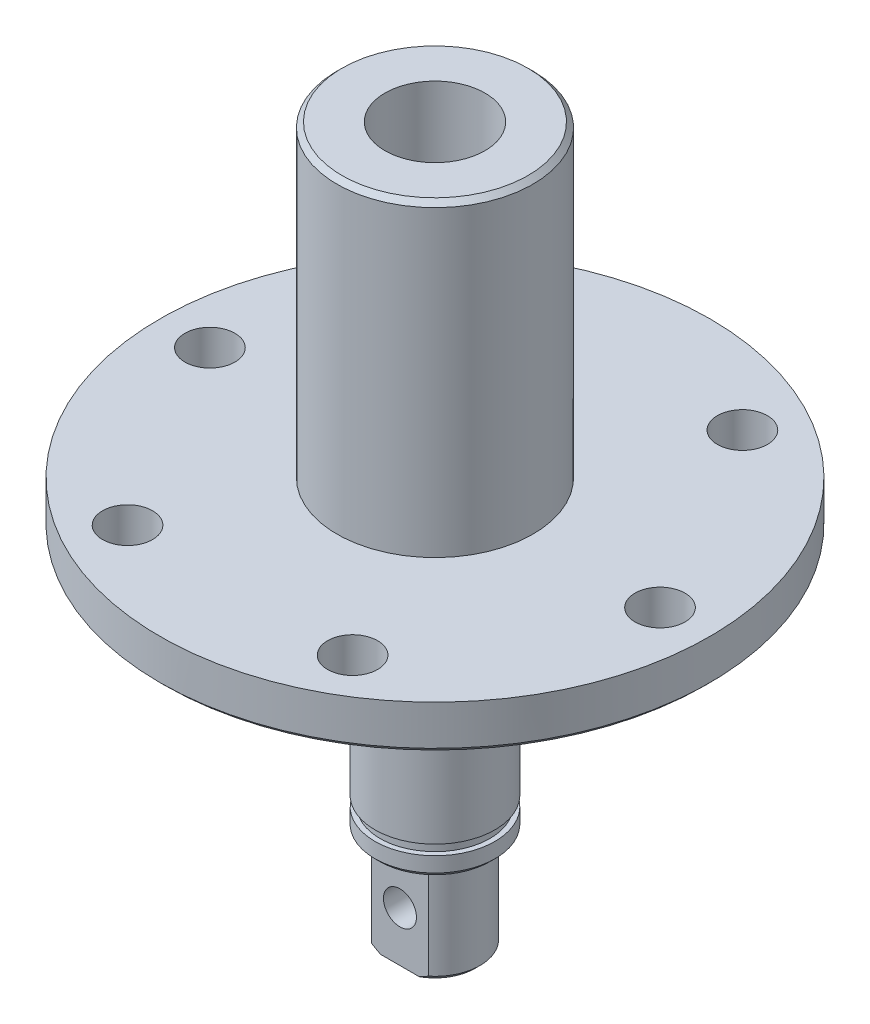
ISO-10303-21;
HEADER;
FILE_DESCRIPTION(('STEP AP214'),'2;1');
FILE_NAME('part.step','',(''),(''),'','','');
FILE_SCHEMA(('AUTOMOTIVE_DESIGN { 1 0 10303 214 1 1 1 1 }'));
ENDSEC;
DATA;
#1=APPLICATION_CONTEXT('core data for automotive mechanical design processes');
#2=APPLICATION_PROTOCOL_DEFINITION('international standard','automotive_design',2000,#1);
#3=PRODUCT_CONTEXT('',#1,'mechanical');
#4=PRODUCT('Part','Part','',(#3));
#5=PRODUCT_RELATED_PRODUCT_CATEGORY('part','',(#4));
#6=PRODUCT_DEFINITION_FORMATION('','',#4);
#7=PRODUCT_DEFINITION_CONTEXT('part definition',#1,'design');
#8=PRODUCT_DEFINITION('design','',#6,#7);
#9=PRODUCT_DEFINITION_SHAPE('','',#8);
#10=(LENGTH_UNIT() NAMED_UNIT(*) SI_UNIT(.MILLI.,.METRE.));
#11=(NAMED_UNIT(*) PLANE_ANGLE_UNIT() SI_UNIT($,.RADIAN.));
#12=(NAMED_UNIT(*) SI_UNIT($,.STERADIAN.) SOLID_ANGLE_UNIT());
#13=UNCERTAINTY_MEASURE_WITH_UNIT(LENGTH_MEASURE(1.E-05),#10,'distance_accuracy_value','');
#14=(GEOMETRIC_REPRESENTATION_CONTEXT(3) GLOBAL_UNCERTAINTY_ASSIGNED_CONTEXT((#13)) GLOBAL_UNIT_ASSIGNED_CONTEXT((#10,
#11,#12)) REPRESENTATION_CONTEXT('',''));
#15=CARTESIAN_POINT('',(0.,0.,0.));
#16=DIRECTION('',(0.,0.,1.));
#17=DIRECTION('',(1.,0.,0.));
#18=AXIS2_PLACEMENT_3D('',#15,#16,#17);
#19=CARTESIAN_POINT('',(0.,-35.5000000000132,0.));
#20=DIRECTION('',(0.,1.,0.));
#21=DIRECTION('',(0.,0.,1.));
#22=AXIS2_PLACEMENT_3D('',#19,#20,#21);
#23=CONICAL_SURFACE('',#22,4.50000000000728,0.785398163397448);
#24=CARTESIAN_POINT('',(-2.82842712475474,-35.5000000000151,-3.5));
#25=CARTESIAN_POINT('',(-2.75622586338194,-35.5453737170798,-3.5));
#26=CARTESIAN_POINT('',(-2.68355248238269,-35.5900081388515,-3.5));
#27=CARTESIAN_POINT('',(-2.53721817161057,-35.6774981598045,-3.5));
#28=CARTESIAN_POINT('',(-2.46355802504001,-35.7203550705901,-3.5));
#29=CARTESIAN_POINT('',(-2.31508833053428,-35.8040646548458,-3.5));
#30=CARTESIAN_POINT('',(-2.24027862426758,-35.8449170489204,-3.5));
#31=CARTESIAN_POINT('',(-2.08936628540242,-35.9242977474013,-3.5));
#32=CARTESIAN_POINT('',(-2.01326272190324,-35.9628242791198,-3.5));
#33=CARTESIAN_POINT('',(-1.93649167311454,-36.0000000000152,-3.5));
#34=B_SPLINE_CURVE_WITH_KNOTS('',3,(#24,#25,#26,#27,#28,#29,#30,#31,#32,#33),.UNSPECIFIED.,.F.,
.F.,(4,2,2,2,4),(0.,0.255829091678936,0.511465923841207,0.767138286787565,1.02300311577789),.UNSPECIFIED.);
#35=CARTESIAN_POINT('',(-2.82842712475046,-35.5000000000076,-3.5));
#36=VERTEX_POINT('',#35);
#37=CARTESIAN_POINT('',(-1.93649167312885,-36.0000000000083,-3.5));
#38=VERTEX_POINT('',#37);
#39=EDGE_CURVE('E81',#36,#38,#34,.T.);
#40=ORIENTED_EDGE('',*,*,#39,.T.);
#41=CARTESIAN_POINT('',(0.,-36.0000000000014,0.));
#42=DIRECTION('',(0.,1.,0.));
#43=DIRECTION('',(0.,0.,1.));
#44=AXIS2_PLACEMENT_3D('',#41,#42,#43);
#45=CIRCLE('',#44,4.0000000000191);
#46=CARTESIAN_POINT('',(-1.93649167312885,-36.0000000000083,3.5));
#47=VERTEX_POINT('',#46);
#48=EDGE_CURVE('E79',#47,#38,#45,.F.);
#49=ORIENTED_EDGE('',*,*,#48,.F.);
#50=CARTESIAN_POINT('',(-1.93649167311454,-36.0000000000152,3.5));
#51=CARTESIAN_POINT('',(-2.01326272190325,-35.9628242791198,3.5));
#52=CARTESIAN_POINT('',(-2.08936628540243,-35.9242977474013,3.5));
#53=CARTESIAN_POINT('',(-2.24027862426758,-35.8449170489204,3.5));
#54=CARTESIAN_POINT('',(-2.31508833053428,-35.8040646548458,3.5));
#55=CARTESIAN_POINT('',(-2.46355802504001,-35.7203550705901,3.5));
#56=CARTESIAN_POINT('',(-2.53721817161057,-35.6774981598045,3.5));
#57=CARTESIAN_POINT('',(-2.68355248238269,-35.5900081388515,3.5));
#58=CARTESIAN_POINT('',(-2.75622586338194,-35.5453737170798,3.5));
#59=CARTESIAN_POINT('',(-2.82842712475474,-35.5000000000151,3.5));
#60=B_SPLINE_CURVE_WITH_KNOTS('',3,(#50,#51,#52,#53,#54,#55,#56,#57,#58,#59),.UNSPECIFIED.,.F.,
.F.,(4,2,2,2,4),(0.,0.255864828990319,0.511537191936677,0.767174024098948,1.02300311577788),.UNSPECIFIED.);
#61=CARTESIAN_POINT('',(-2.82842712475046,-35.5000000000076,3.5));
#62=VERTEX_POINT('',#61);
#63=EDGE_CURVE('E21',#47,#62,#60,.T.);
#64=ORIENTED_EDGE('',*,*,#63,.T.);
#65=CARTESIAN_POINT('',(0.,-35.5,0.));
#66=DIRECTION('',(0.,1.,0.));
#67=DIRECTION('',(0.,0.,1.));
#68=AXIS2_PLACEMENT_3D('',#65,#66,#67);
#69=CIRCLE('',#68,4.5);
#70=EDGE_CURVE('E76',#36,#62,#69,.T.);
#71=ORIENTED_EDGE('',*,*,#70,.F.);
#72=EDGE_LOOP('',(#40,#49,#64,#71));
#73=FACE_BOUND('',#72,.T.);
#74=ADVANCED_FACE('F17',(#73),#23,.T.);
#75=CARTESIAN_POINT('',(0.,-35.5000000000132,0.));
#76=DIRECTION('',(0.,1.,0.));
#77=DIRECTION('',(0.,0.,1.));
#78=AXIS2_PLACEMENT_3D('',#75,#76,#77);
#79=CONICAL_SURFACE('',#78,4.50000000000728,0.785398163397448);
#80=CARTESIAN_POINT('',(2.8284271247554,-35.5000000000147,3.5));
#81=CARTESIAN_POINT('',(2.75622586338244,-35.5453737170795,3.5));
#82=CARTESIAN_POINT('',(2.68355248238303,-35.5900081388512,3.5));
#83=CARTESIAN_POINT('',(2.53721817161058,-35.6774981598045,3.5));
#84=CARTESIAN_POINT('',(2.46355802503985,-35.7203550705902,3.5));
#85=CARTESIAN_POINT('',(2.31508833053378,-35.8040646548461,3.5));
#86=CARTESIAN_POINT('',(2.24027862426691,-35.8449170489208,3.5));
#87=CARTESIAN_POINT('',(2.08936628540139,-35.9242977474018,3.5));
#88=CARTESIAN_POINT('',(2.01326272190203,-35.9628242791204,3.5));
#89=CARTESIAN_POINT('',(1.93649167311315,-36.0000000000159,3.5));
#90=B_SPLINE_CURVE_WITH_KNOTS('',3,(#80,#81,#82,#83,#84,#85,#86,#87,#88,#89),.UNSPECIFIED.,.F.,
.F.,(4,2,2,2,4),(0.,0.255829091679521,0.511465923842371,0.76713828678931,1.02300311578021),.UNSPECIFIED.);
#91=CARTESIAN_POINT('',(2.8284271247508,-35.5000000000073,3.5));
#92=VERTEX_POINT('',#91);
#93=CARTESIAN_POINT('',(1.93649167312816,-36.0000000000086,3.5));
#94=VERTEX_POINT('',#93);
#95=EDGE_CURVE('E102',#92,#94,#90,.T.);
#96=ORIENTED_EDGE('',*,*,#95,.T.);
#97=CARTESIAN_POINT('',(0.,-36.0000000000014,0.));
#98=DIRECTION('',(0.,1.,0.));
#99=DIRECTION('',(0.,0.,1.));
#100=AXIS2_PLACEMENT_3D('',#97,#98,#99);
#101=CIRCLE('',#100,4.0000000000191);
#102=CARTESIAN_POINT('',(1.93649167312885,-36.0000000000083,-3.5));
#103=VERTEX_POINT('',#102);
#104=EDGE_CURVE('E89',#103,#94,#101,.F.);
#105=ORIENTED_EDGE('',*,*,#104,.F.);
#106=CARTESIAN_POINT('',(1.93649167311454,-36.0000000000152,-3.5));
#107=CARTESIAN_POINT('',(2.01326272190325,-35.9628242791198,-3.5));
#108=CARTESIAN_POINT('',(2.08936628540243,-35.9242977474013,-3.5));
#109=CARTESIAN_POINT('',(2.24027862426758,-35.8449170489204,-3.5));
#110=CARTESIAN_POINT('',(2.31508833053428,-35.8040646548458,-3.5));
#111=CARTESIAN_POINT('',(2.46355802504001,-35.7203550705901,-3.5));
#112=CARTESIAN_POINT('',(2.53721817161057,-35.6774981598045,-3.5));
#113=CARTESIAN_POINT('',(2.68355248238269,-35.5900081388515,-3.5));
#114=CARTESIAN_POINT('',(2.75622586338194,-35.5453737170798,-3.5));
#115=CARTESIAN_POINT('',(2.82842712475474,-35.5000000000151,-3.5));
#116=B_SPLINE_CURVE_WITH_KNOTS('',3,(#106,#107,#108,#109,#110,#111,#112,#113,#114,#115),
.UNSPECIFIED.,.F.,.F.,(4,2,2,2,4),(0.,0.255864828990319,0.511537191936677,0.767174024098948,
1.02300311577788),.UNSPECIFIED.);
#117=CARTESIAN_POINT('',(2.82842712475046,-35.5000000000076,-3.5));
#118=VERTEX_POINT('',#117);
#119=EDGE_CURVE('E212',#103,#118,#116,.T.);
#120=ORIENTED_EDGE('',*,*,#119,.T.);
#121=CARTESIAN_POINT('',(0.,-35.5,0.));
#122=DIRECTION('',(0.,1.,0.));
#123=DIRECTION('',(0.,0.,1.));
#124=AXIS2_PLACEMENT_3D('',#121,#122,#123);
#125=CIRCLE('',#124,4.5);
#126=EDGE_CURVE('E100',#92,#118,#125,.T.);
#127=ORIENTED_EDGE('',*,*,#126,.F.);
#128=EDGE_LOOP('',(#96,#105,#120,#127));
#129=FACE_BOUND('',#128,.T.);
#130=ADVANCED_FACE('F203',(#129),#79,.T.);
#131=CARTESIAN_POINT('',(0.,-31.,-3.5));
#132=DIRECTION('',(0.,0.,-1.));
#133=DIRECTION('',(-1.,0.,0.));
#134=AXIS2_PLACEMENT_3D('',#131,#132,#133);
#135=CYLINDRICAL_SURFACE('',#134,1.65);
#136=CARTESIAN_POINT('',(0.,-31.,3.5));
#137=DIRECTION('',(0.,0.,-1.));
#138=DIRECTION('',(-1.,0.,0.));
#139=AXIS2_PLACEMENT_3D('',#136,#137,#138);
#140=CIRCLE('',#139,1.65);
#141=CARTESIAN_POINT('',(-1.65,-31.,3.5));
#142=VERTEX_POINT('',#141);
#143=EDGE_CURVE('E88',#142,#142,#140,.F.);
#144=ORIENTED_EDGE('',*,*,#143,.T.);
#145=EDGE_LOOP('',(#144));
#146=FACE_BOUND('',#145,.T.);
#147=CARTESIAN_POINT('',(0.,-31.,-3.5));
#148=DIRECTION('',(0.,0.,-1.));
#149=DIRECTION('',(-1.,0.,0.));
#150=AXIS2_PLACEMENT_3D('',#147,#148,#149);
#151=CIRCLE('',#150,1.65);
#152=CARTESIAN_POINT('',(-1.65,-31.,-3.5));
#153=VERTEX_POINT('',#152);
#154=EDGE_CURVE('E107',#153,#153,#151,.T.);
#155=ORIENTED_EDGE('',*,*,#154,.T.);
#156=EDGE_LOOP('',(#155));
#157=FACE_BOUND('',#156,.T.);
#158=ADVANCED_FACE('F207',(#146,#157),#135,.F.);
#159=CARTESIAN_POINT('',(0.,-36.,0.));
#160=DIRECTION('',(0.,-1.,0.));
#161=DIRECTION('',(0.,0.,-1.));
#162=AXIS2_PLACEMENT_3D('',#159,#160,#161);
#163=PLANE('',#162);
#164=DIRECTION('',(1.,0.,0.));
#165=VECTOR('',#164,1.);
#166=CARTESIAN_POINT('',(-2.82842712474619,-36.,-3.5));
#167=LINE('',#166,#165);
#168=EDGE_CURVE('E191',#38,#103,#167,.T.);
#169=ORIENTED_EDGE('',*,*,#168,.T.);
#170=ORIENTED_EDGE('',*,*,#104,.T.);
#171=DIRECTION('',(-1.,0.,0.));
#172=VECTOR('',#171,1.);
#173=CARTESIAN_POINT('',(-2.82842712474619,-36.,3.5));
#174=LINE('',#173,#172);
#175=EDGE_CURVE('E97',#94,#47,#174,.T.);
#176=ORIENTED_EDGE('',*,*,#175,.T.);
#177=ORIENTED_EDGE('',*,*,#48,.T.);
#178=EDGE_LOOP('',(#169,#170,#176,#177));
#179=FACE_BOUND('',#178,.T.);
#180=ADVANCED_FACE('F359',(#179),#163,.T.);
#181=CARTESIAN_POINT('',(0.,-36.,0.));
#182=DIRECTION('',(0.,1.,0.));
#183=DIRECTION('',(0.,0.,1.));
#184=AXIS2_PLACEMENT_3D('',#181,#182,#183);
#185=CYLINDRICAL_SURFACE('',#184,4.5);
#186=DIRECTION('',(0.,1.,0.));
#187=VECTOR('',#186,1.);
#188=CARTESIAN_POINT('',(-2.82842712474619,-26.,3.5));
#189=LINE('',#188,#187);
#190=CARTESIAN_POINT('',(-2.82842712474619,-26.,3.5));
#191=VERTEX_POINT('',#190);
#192=EDGE_CURVE('E84',#62,#191,#189,.T.);
#193=ORIENTED_EDGE('',*,*,#192,.T.);
#194=CARTESIAN_POINT('',(0.,-26.,0.));
#195=DIRECTION('',(0.,1.,0.));
#196=DIRECTION('',(0.,0.,1.));
#197=AXIS2_PLACEMENT_3D('',#194,#195,#196);
#198=CIRCLE('',#197,4.5);
#199=CARTESIAN_POINT('',(-2.82842712474619,-26.,-3.5));
#200=VERTEX_POINT('',#199);
#201=EDGE_CURVE('E189',#200,#191,#198,.T.);
#202=ORIENTED_EDGE('',*,*,#201,.F.);
#203=DIRECTION('',(0.,1.,0.));
#204=VECTOR('',#203,1.);
#205=CARTESIAN_POINT('',(-2.82842712474619,-26.,-3.5));
#206=LINE('',#205,#204);
#207=EDGE_CURVE('E87',#200,#36,#206,.F.);
#208=ORIENTED_EDGE('',*,*,#207,.T.);
#209=ORIENTED_EDGE('',*,*,#70,.T.);
#210=EDGE_LOOP('',(#193,#202,#208,#209));
#211=FACE_BOUND('',#210,.T.);
#212=ADVANCED_FACE('F83',(#211),#185,.T.);
#213=CARTESIAN_POINT('',(-2.82842712474619,-26.,3.5));
#214=DIRECTION('',(0.,0.,-1.));
#215=DIRECTION('',(-1.,0.,0.));
#216=AXIS2_PLACEMENT_3D('',#213,#214,#215);
#217=PLANE('',#216);
#218=ORIENTED_EDGE('',*,*,#63,.F.);
#219=ORIENTED_EDGE('',*,*,#175,.F.);
#220=ORIENTED_EDGE('',*,*,#95,.F.);
#221=DIRECTION('',(0.,1.,0.));
#222=VECTOR('',#221,1.);
#223=CARTESIAN_POINT('',(2.82842712474619,-36.,3.5));
#224=LINE('',#223,#222);
#225=CARTESIAN_POINT('',(2.82842712474619,-26.,3.5));
#226=VERTEX_POINT('',#225);
#227=EDGE_CURVE('E96',#226,#92,#224,.F.);
#228=ORIENTED_EDGE('',*,*,#227,.F.);
#229=DIRECTION('',(1.,0.,0.));
#230=VECTOR('',#229,1.);
#231=CARTESIAN_POINT('',(0.,-26.,3.5));
#232=LINE('',#231,#230);
#233=EDGE_CURVE('E94',#191,#226,#232,.T.);
#234=ORIENTED_EDGE('',*,*,#233,.F.);
#235=ORIENTED_EDGE('',*,*,#192,.F.);
#236=EDGE_LOOP('',(#218,#219,#220,#228,#234,#235));
#237=FACE_BOUND('',#236,.T.);
#238=ORIENTED_EDGE('',*,*,#143,.F.);
#239=EDGE_LOOP('',(#238));
#240=FACE_BOUND('',#239,.T.);
#241=ADVANCED_FACE('F91',(#237,#240),#217,.F.);
#242=CARTESIAN_POINT('',(0.,-36.,0.));
#243=DIRECTION('',(0.,1.,0.));
#244=DIRECTION('',(0.,0.,1.));
#245=AXIS2_PLACEMENT_3D('',#242,#243,#244);
#246=CYLINDRICAL_SURFACE('',#245,4.5);
#247=DIRECTION('',(0.,1.,0.));
#248=VECTOR('',#247,1.);
#249=CARTESIAN_POINT('',(2.82842712474619,-26.,-3.5));
#250=LINE('',#249,#248);
#251=CARTESIAN_POINT('',(2.82842712474619,-26.,-3.5));
#252=VERTEX_POINT('',#251);
#253=EDGE_CURVE('E194',#118,#252,#250,.T.);
#254=ORIENTED_EDGE('',*,*,#253,.T.);
#255=CARTESIAN_POINT('',(0.,-26.,0.));
#256=DIRECTION('',(0.,1.,0.));
#257=DIRECTION('',(0.,0.,1.));
#258=AXIS2_PLACEMENT_3D('',#255,#256,#257);
#259=CIRCLE('',#258,4.5);
#260=EDGE_CURVE('E186',#226,#252,#259,.T.);
#261=ORIENTED_EDGE('',*,*,#260,.F.);
#262=ORIENTED_EDGE('',*,*,#227,.T.);
#263=ORIENTED_EDGE('',*,*,#126,.T.);
#264=EDGE_LOOP('',(#254,#261,#262,#263));
#265=FACE_BOUND('',#264,.T.);
#266=ADVANCED_FACE('F226',(#265),#246,.T.);
#267=CARTESIAN_POINT('',(-2.82842712474619,-26.,-3.5));
#268=DIRECTION('',(0.,0.,1.));
#269=DIRECTION('',(1.,0.,0.));
#270=AXIS2_PLACEMENT_3D('',#267,#268,#269);
#271=PLANE('',#270);
#272=ORIENTED_EDGE('',*,*,#39,.F.);
#273=ORIENTED_EDGE('',*,*,#207,.F.);
#274=DIRECTION('',(1.,0.,0.));
#275=VECTOR('',#274,1.);
#276=CARTESIAN_POINT('',(0.,-26.,-3.5));
#277=LINE('',#276,#275);
#278=EDGE_CURVE('E185',#252,#200,#277,.F.);
#279=ORIENTED_EDGE('',*,*,#278,.F.);
#280=ORIENTED_EDGE('',*,*,#253,.F.);
#281=ORIENTED_EDGE('',*,*,#119,.F.);
#282=ORIENTED_EDGE('',*,*,#168,.F.);
#283=EDGE_LOOP('',(#272,#273,#279,#280,#281,#282));
#284=FACE_BOUND('',#283,.T.);
#285=ORIENTED_EDGE('',*,*,#154,.F.);
#286=EDGE_LOOP('',(#285));
#287=FACE_BOUND('',#286,.T.);
#288=ADVANCED_FACE('F221',(#284,#287),#271,.F.);
#289=CARTESIAN_POINT('',(0.,-26.,0.));
#290=DIRECTION('',(0.,-1.,0.));
#291=DIRECTION('',(0.,0.,-1.));
#292=AXIS2_PLACEMENT_3D('',#289,#290,#291);
#293=PLANE('',#292);
#294=ORIENTED_EDGE('',*,*,#260,.T.);
#295=ORIENTED_EDGE('',*,*,#278,.T.);
#296=ORIENTED_EDGE('',*,*,#201,.T.);
#297=ORIENTED_EDGE('',*,*,#233,.T.);
#298=EDGE_LOOP('',(#294,#295,#296,#297));
#299=FACE_BOUND('',#298,.T.);
#300=CARTESIAN_POINT('',(0.,-26.0000000000105,0.));
#301=DIRECTION('',(0.,1.,0.));
#302=DIRECTION('',(0.,0.,1.));
#303=AXIS2_PLACEMENT_3D('',#300,#301,#302);
#304=CIRCLE('',#303,5.49999999992679);
#305=CARTESIAN_POINT('',(0.,-26.0000000000105,5.49999999992679));
#306=VERTEX_POINT('',#305);
#307=EDGE_CURVE('E182',#306,#306,#304,.T.);
#308=ORIENTED_EDGE('',*,*,#307,.F.);
#309=EDGE_LOOP('',(#308));
#310=FACE_BOUND('',#309,.T.);
#311=ADVANCED_FACE('F225',(#299,#310),#293,.T.);
#312=CARTESIAN_POINT('',(0.,-25.5000000000791,0.));
#313=DIRECTION('',(0.,1.,0.));
#314=DIRECTION('',(0.,0.,1.));
#315=AXIS2_PLACEMENT_3D('',#312,#313,#314);
#316=CONICAL_SURFACE('',#315,5.99999999985812,0.785398163397448);
#317=CARTESIAN_POINT('',(0.,-25.5,0.));
#318=DIRECTION('',(0.,1.,0.));
#319=DIRECTION('',(0.,0.,1.));
#320=AXIS2_PLACEMENT_3D('',#317,#318,#319);
#321=CIRCLE('',#320,6.);
#322=CARTESIAN_POINT('',(0.,-25.5,6.));
#323=VERTEX_POINT('',#322);
#324=EDGE_CURVE('E181',#323,#323,#321,.T.);
#325=ORIENTED_EDGE('',*,*,#324,.F.);
#326=EDGE_LOOP('',(#325));
#327=FACE_BOUND('',#326,.T.);
#328=ORIENTED_EDGE('',*,*,#307,.T.);
#329=EDGE_LOOP('',(#328));
#330=FACE_BOUND('',#329,.T.);
#331=ADVANCED_FACE('F329',(#327,#330),#316,.T.);
#332=CARTESIAN_POINT('',(0.,-26.,0.));
#333=DIRECTION('',(0.,1.,0.));
#334=DIRECTION('',(0.,0.,1.));
#335=AXIS2_PLACEMENT_3D('',#332,#333,#334);
#336=CYLINDRICAL_SURFACE('',#335,6.);
#337=CARTESIAN_POINT('',(0.,-24.,0.));
#338=DIRECTION('',(0.,1.,0.));
#339=DIRECTION('',(0.,0.,1.));
#340=AXIS2_PLACEMENT_3D('',#337,#338,#339);
#341=CIRCLE('',#340,6.);
#342=CARTESIAN_POINT('',(0.,-24.,6.));
#343=VERTEX_POINT('',#342);
#344=EDGE_CURVE('E178',#343,#343,#341,.T.);
#345=ORIENTED_EDGE('',*,*,#344,.F.);
#346=EDGE_LOOP('',(#345));
#347=FACE_BOUND('',#346,.T.);
#348=ORIENTED_EDGE('',*,*,#324,.T.);
#349=EDGE_LOOP('',(#348));
#350=FACE_BOUND('',#349,.T.);
#351=ADVANCED_FACE('F326',(#347,#350),#336,.T.);
#352=CARTESIAN_POINT('',(-6.,-24.,0.));
#353=DIRECTION('',(0.,1.,0.));
#354=DIRECTION('',(0.,0.,1.));
#355=AXIS2_PLACEMENT_3D('',#352,#353,#354);
#356=PLANE('',#355);
#357=ORIENTED_EDGE('',*,*,#344,.T.);
#358=EDGE_LOOP('',(#357));
#359=FACE_BOUND('',#358,.T.);
#360=CARTESIAN_POINT('',(0.,-24.,0.));
#361=DIRECTION('',(0.,-1.,0.));
#362=DIRECTION('',(0.,0.,-1.));
#363=AXIS2_PLACEMENT_3D('',#360,#361,#362);
#364=CIRCLE('',#363,5.5);
#365=CARTESIAN_POINT('',(0.,-24.,-5.5));
#366=VERTEX_POINT('',#365);
#367=EDGE_CURVE('E175',#366,#366,#364,.F.);
#368=ORIENTED_EDGE('',*,*,#367,.F.);
#369=EDGE_LOOP('',(#368));
#370=FACE_BOUND('',#369,.T.);
#371=ADVANCED_FACE('F322',(#359,#370),#356,.T.);
#372=CARTESIAN_POINT('',(0.,-26.,0.));
#373=DIRECTION('',(0.,-1.,0.));
#374=DIRECTION('',(0.,0.,-1.));
#375=AXIS2_PLACEMENT_3D('',#372,#373,#374);
#376=CYLINDRICAL_SURFACE('',#375,5.5);
#377=CARTESIAN_POINT('',(0.,-23.,0.));
#378=DIRECTION('',(0.,-1.,0.));
#379=DIRECTION('',(0.,0.,-1.));
#380=AXIS2_PLACEMENT_3D('',#377,#378,#379);
#381=CIRCLE('',#380,5.5);
#382=CARTESIAN_POINT('',(0.,-23.,-5.5));
#383=VERTEX_POINT('',#382);
#384=EDGE_CURVE('E172',#383,#383,#381,.F.);
#385=ORIENTED_EDGE('',*,*,#384,.F.);
#386=EDGE_LOOP('',(#385));
#387=FACE_BOUND('',#386,.T.);
#388=ORIENTED_EDGE('',*,*,#367,.T.);
#389=EDGE_LOOP('',(#388));
#390=FACE_BOUND('',#389,.T.);
#391=ADVANCED_FACE('F318',(#387,#390),#376,.T.);
#392=CARTESIAN_POINT('',(-6.,-23.,0.));
#393=DIRECTION('',(0.,-1.,0.));
#394=DIRECTION('',(0.,0.,-1.));
#395=AXIS2_PLACEMENT_3D('',#392,#393,#394);
#396=PLANE('',#395);
#397=ORIENTED_EDGE('',*,*,#384,.T.);
#398=EDGE_LOOP('',(#397));
#399=FACE_BOUND('',#398,.T.);
#400=CARTESIAN_POINT('',(0.,-23.,0.));
#401=DIRECTION('',(0.,1.,0.));
#402=DIRECTION('',(0.,0.,1.));
#403=AXIS2_PLACEMENT_3D('',#400,#401,#402);
#404=CIRCLE('',#403,6.);
#405=CARTESIAN_POINT('',(0.,-23.,6.));
#406=VERTEX_POINT('',#405);
#407=EDGE_CURVE('E169',#406,#406,#404,.T.);
#408=ORIENTED_EDGE('',*,*,#407,.F.);
#409=EDGE_LOOP('',(#408));
#410=FACE_BOUND('',#409,.T.);
#411=ADVANCED_FACE('F314',(#399,#410),#396,.T.);
#412=CARTESIAN_POINT('',(0.,-26.,0.));
#413=DIRECTION('',(0.,1.,0.));
#414=DIRECTION('',(0.,0.,1.));
#415=AXIS2_PLACEMENT_3D('',#412,#413,#414);
#416=CYLINDRICAL_SURFACE('',#415,6.);
#417=CARTESIAN_POINT('',(0.,-13.,0.));
#418=DIRECTION('',(0.,1.,0.));
#419=DIRECTION('',(0.,0.,1.));
#420=AXIS2_PLACEMENT_3D('',#417,#418,#419);
#421=CIRCLE('',#420,6.);
#422=CARTESIAN_POINT('',(0.,-13.,6.));
#423=VERTEX_POINT('',#422);
#424=EDGE_CURVE('E166',#423,#423,#421,.T.);
#425=ORIENTED_EDGE('',*,*,#424,.F.);
#426=EDGE_LOOP('',(#425));
#427=FACE_BOUND('',#426,.T.);
#428=ORIENTED_EDGE('',*,*,#407,.T.);
#429=EDGE_LOOP('',(#428));
#430=FACE_BOUND('',#429,.T.);
#431=ADVANCED_FACE('F310',(#427,#430),#416,.T.);
#432=CARTESIAN_POINT('',(0.,-13.,0.));
#433=DIRECTION('',(0.,-1.,0.));
#434=DIRECTION('',(0.,0.,-1.));
#435=AXIS2_PLACEMENT_3D('',#432,#433,#434);
#436=PLANE('',#435);
#437=ORIENTED_EDGE('',*,*,#424,.T.);
#438=EDGE_LOOP('',(#437));
#439=FACE_BOUND('',#438,.T.);
#440=CARTESIAN_POINT('',(0.,-13.,0.));
#441=DIRECTION('',(0.,1.,0.));
#442=DIRECTION('',(0.,0.,1.));
#443=AXIS2_PLACEMENT_3D('',#440,#441,#442);
#444=CIRCLE('',#443,8.50000000000003);
#445=CARTESIAN_POINT('',(0.,-13.,8.50000000000003));
#446=VERTEX_POINT('',#445);
#447=EDGE_CURVE('E162',#446,#446,#444,.T.);
#448=ORIENTED_EDGE('',*,*,#447,.F.);
#449=EDGE_LOOP('',(#448));
#450=FACE_BOUND('',#449,.T.);
#451=ADVANCED_FACE('F307',(#439,#450),#436,.T.);
#452=CARTESIAN_POINT('',(0.,7.29999999987285,0.));
#453=DIRECTION('',(0.,1.,0.));
#454=DIRECTION('',(-1.,0.,0.));
#455=AXIS2_PLACEMENT_3D('',#452,#453,#454);
#456=CONICAL_SURFACE('',#455,4.99999999976808,1.02974425861336);
#457=CARTESIAN_POINT('',(0.,4.29569690481912,0.));
#458=VERTEX_POINT('',#457);
#459=VERTEX_LOOP('',#458);
#460=FACE_BOUND('',#459,.T.);
#461=CARTESIAN_POINT('',(0.,7.3,0.));
#462=DIRECTION('',(0.,1.,0.));
#463=DIRECTION('',(0.,0.,1.));
#464=AXIS2_PLACEMENT_3D('',#461,#462,#463);
#465=CIRCLE('',#464,5.);
#466=CARTESIAN_POINT('',(0.,7.3,5.));
#467=VERTEX_POINT('',#466);
#468=EDGE_CURVE('E165',#467,#467,#465,.T.);
#469=ORIENTED_EDGE('',*,*,#468,.T.);
#470=EDGE_LOOP('',(#469));
#471=FACE_BOUND('',#470,.T.);
#472=ADVANCED_FACE('F303',(#460,#471),#456,.F.);
#473=CARTESIAN_POINT('',(0.,-12.5,0.));
#474=DIRECTION('',(0.,1.,0.));
#475=DIRECTION('',(0.,0.,1.));
#476=AXIS2_PLACEMENT_3D('',#473,#474,#475);
#477=CONICAL_SURFACE('',#476,9.,0.785398163397459);
#478=ORIENTED_EDGE('',*,*,#447,.T.);
#479=EDGE_LOOP('',(#478));
#480=FACE_BOUND('',#479,.T.);
#481=CARTESIAN_POINT('',(0.,-12.5,0.));
#482=DIRECTION('',(0.,1.,0.));
#483=DIRECTION('',(0.,0.,1.));
#484=AXIS2_PLACEMENT_3D('',#481,#482,#483);
#485=CIRCLE('',#484,9.);
#486=CARTESIAN_POINT('',(0.,-12.5,9.));
#487=VERTEX_POINT('',#486);
#488=EDGE_CURVE('E161',#487,#487,#485,.T.);
#489=ORIENTED_EDGE('',*,*,#488,.F.);
#490=EDGE_LOOP('',(#489));
#491=FACE_BOUND('',#490,.T.);
#492=ADVANCED_FACE('F299',(#480,#491),#477,.T.);
#493=CARTESIAN_POINT('',(0.,35.3,0.));
#494=DIRECTION('',(0.,1.,0.));
#495=DIRECTION('',(0.,0.,1.));
#496=AXIS2_PLACEMENT_3D('',#493,#494,#495);
#497=CYLINDRICAL_SURFACE('',#496,5.);
#498=CARTESIAN_POINT('',(0.,35.3,0.));
#499=DIRECTION('',(0.,1.,0.));
#500=DIRECTION('',(0.,0.,1.));
#501=AXIS2_PLACEMENT_3D('',#498,#499,#500);
#502=CIRCLE('',#501,5.);
#503=CARTESIAN_POINT('',(0.,35.3,5.));
#504=VERTEX_POINT('',#503);
#505=EDGE_CURVE('E158',#504,#504,#502,.F.);
#506=ORIENTED_EDGE('',*,*,#505,.F.);
#507=EDGE_LOOP('',(#506));
#508=FACE_BOUND('',#507,.T.);
#509=ORIENTED_EDGE('',*,*,#468,.F.);
#510=EDGE_LOOP('',(#509));
#511=FACE_BOUND('',#510,.T.);
#512=ADVANCED_FACE('F295',(#508,#511),#497,.F.);
#513=CARTESIAN_POINT('',(0.,-13.,0.));
#514=DIRECTION('',(0.,1.,0.));
#515=DIRECTION('',(0.,0.,1.));
#516=AXIS2_PLACEMENT_3D('',#513,#514,#515);
#517=CYLINDRICAL_SURFACE('',#516,9.);
#518=ORIENTED_EDGE('',*,*,#488,.T.);
#519=EDGE_LOOP('',(#518));
#520=FACE_BOUND('',#519,.T.);
#521=CARTESIAN_POINT('',(0.,0.,0.));
#522=DIRECTION('',(0.,1.,0.));
#523=DIRECTION('',(0.,0.,1.));
#524=AXIS2_PLACEMENT_3D('',#521,#522,#523);
#525=CIRCLE('',#524,9.);
#526=CARTESIAN_POINT('',(0.,0.,9.));
#527=VERTEX_POINT('',#526);
#528=EDGE_CURVE('E152',#527,#527,#525,.F.);
#529=ORIENTED_EDGE('',*,*,#528,.T.);
#530=EDGE_LOOP('',(#529));
#531=FACE_BOUND('',#530,.T.);
#532=ADVANCED_FACE('F291',(#520,#531),#517,.T.);
#533=CARTESIAN_POINT('',(0.,35.3,0.));
#534=DIRECTION('',(0.,1.,0.));
#535=DIRECTION('',(0.,0.,1.));
#536=AXIS2_PLACEMENT_3D('',#533,#534,#535);
#537=PLANE('',#536);
#538=CARTESIAN_POINT('',(0.,35.3,0.));
#539=DIRECTION('',(0.,-1.,0.));
#540=DIRECTION('',(0.,0.,-1.));
#541=AXIS2_PLACEMENT_3D('',#538,#539,#540);
#542=CIRCLE('',#541,9.30000000000007);
#543=CARTESIAN_POINT('',(0.,35.3,-9.30000000000007));
#544=VERTEX_POINT('',#543);
#545=EDGE_CURVE('E149',#544,#544,#542,.T.);
#546=ORIENTED_EDGE('',*,*,#545,.F.);
#547=EDGE_LOOP('',(#546));
#548=FACE_BOUND('',#547,.T.);
#549=ORIENTED_EDGE('',*,*,#505,.T.);
#550=EDGE_LOOP('',(#549));
#551=FACE_BOUND('',#550,.T.);
#552=ADVANCED_FACE('F287',(#548,#551),#537,.T.);
#553=CARTESIAN_POINT('',(0.,0.500000000000004,0.));
#554=DIRECTION('',(0.,1.,0.));
#555=DIRECTION('',(0.,0.,1.));
#556=AXIS2_PLACEMENT_3D('',#553,#554,#555);
#557=CONICAL_SURFACE('',#556,27.5,0.785398163397449);
#558=CARTESIAN_POINT('',(0.,0.500000000000004,0.));
#559=DIRECTION('',(0.,-1.,0.));
#560=DIRECTION('',(0.,0.,-1.));
#561=AXIS2_PLACEMENT_3D('',#558,#559,#560);
#562=CIRCLE('',#561,27.5);
#563=CARTESIAN_POINT('',(0.,0.500000000000004,-27.5));
#564=VERTEX_POINT('',#563);
#565=EDGE_CURVE('E148',#564,#564,#562,.F.);
#566=ORIENTED_EDGE('',*,*,#565,.F.);
#567=EDGE_LOOP('',(#566));
#568=FACE_BOUND('',#567,.T.);
#569=CARTESIAN_POINT('',(0.,0.,0.));
#570=DIRECTION('',(0.,1.,0.));
#571=DIRECTION('',(0.,0.,1.));
#572=AXIS2_PLACEMENT_3D('',#569,#570,#571);
#573=CIRCLE('',#572,27.);
#574=CARTESIAN_POINT('',(0.,0.,27.));
#575=VERTEX_POINT('',#574);
#576=EDGE_CURVE('E155',#575,#575,#573,.T.);
#577=ORIENTED_EDGE('',*,*,#576,.T.);
#578=EDGE_LOOP('',(#577));
#579=FACE_BOUND('',#578,.T.);
#580=ADVANCED_FACE('F283',(#568,#579),#557,.T.);
#581=CARTESIAN_POINT('',(0.,0.,0.));
#582=DIRECTION('',(0.,1.,0.));
#583=DIRECTION('',(0.,0.,1.));
#584=AXIS2_PLACEMENT_3D('',#581,#582,#583);
#585=PLANE('',#584);
#586=ORIENTED_EDGE('',*,*,#528,.F.);
#587=EDGE_LOOP('',(#586));
#588=FACE_BOUND('',#587,.T.);
#589=ORIENTED_EDGE('',*,*,#576,.F.);
#590=EDGE_LOOP('',(#589));
#591=FACE_BOUND('',#590,.T.);
#592=CARTESIAN_POINT('',(-11.2500000000003,0.,-19.4855715851497));
#593=DIRECTION('',(0.,1.,0.));
#594=DIRECTION('',(0.,0.,1.));
#595=AXIS2_PLACEMENT_3D('',#592,#593,#594);
#596=CIRCLE('',#595,2.5);
#597=CARTESIAN_POINT('',(-11.2500000000003,0.,-16.9855715851497));
#598=VERTEX_POINT('',#597);
#599=EDGE_CURVE('E130',#598,#598,#596,.T.);
#600=ORIENTED_EDGE('',*,*,#599,.T.);
#601=EDGE_LOOP('',(#600));
#602=FACE_BOUND('',#601,.T.);
#603=CARTESIAN_POINT('',(11.2499999999998,0.,-19.48557158515));
#604=DIRECTION('',(0.,1.,0.));
#605=DIRECTION('',(0.,0.,1.));
#606=AXIS2_PLACEMENT_3D('',#603,#604,#605);
#607=CIRCLE('',#606,2.5);
#608=CARTESIAN_POINT('',(11.2499999999998,0.,-16.98557158515));
#609=VERTEX_POINT('',#608);
#610=EDGE_CURVE('E133',#609,#609,#607,.T.);
#611=ORIENTED_EDGE('',*,*,#610,.T.);
#612=EDGE_LOOP('',(#611));
#613=FACE_BOUND('',#612,.T.);
#614=CARTESIAN_POINT('',(22.5,0.,-1.78451003973734E-13));
#615=DIRECTION('',(0.,1.,0.));
#616=DIRECTION('',(0.,0.,1.));
#617=AXIS2_PLACEMENT_3D('',#614,#615,#616);
#618=CIRCLE('',#617,2.5);
#619=CARTESIAN_POINT('',(22.5,0.,2.49999999999982));
#620=VERTEX_POINT('',#619);
#621=EDGE_CURVE('E136',#620,#620,#618,.T.);
#622=ORIENTED_EDGE('',*,*,#621,.T.);
#623=EDGE_LOOP('',(#622));
#624=FACE_BOUND('',#623,.T.);
#625=CARTESIAN_POINT('',(-22.5,0.,0.));
#626=DIRECTION('',(0.,1.,0.));
#627=DIRECTION('',(0.,0.,1.));
#628=AXIS2_PLACEMENT_3D('',#625,#626,#627);
#629=CIRCLE('',#628,2.5);
#630=CARTESIAN_POINT('',(-22.5,0.,2.5));
#631=VERTEX_POINT('',#630);
#632=EDGE_CURVE('E139',#631,#631,#629,.T.);
#633=ORIENTED_EDGE('',*,*,#632,.T.);
#634=EDGE_LOOP('',(#633));
#635=FACE_BOUND('',#634,.T.);
#636=CARTESIAN_POINT('',(-11.25,0.,19.4855715851499));
#637=DIRECTION('',(0.,1.,0.));
#638=DIRECTION('',(0.,0.,1.));
#639=AXIS2_PLACEMENT_3D('',#636,#637,#638);
#640=CIRCLE('',#639,2.5);
#641=CARTESIAN_POINT('',(-11.25,0.,21.9855715851499));
#642=VERTEX_POINT('',#641);
#643=EDGE_CURVE('E142',#642,#642,#640,.T.);
#644=ORIENTED_EDGE('',*,*,#643,.T.);
#645=EDGE_LOOP('',(#644));
#646=FACE_BOUND('',#645,.T.);
#647=CARTESIAN_POINT('',(11.2500000000001,0.,19.4855715851498));
#648=DIRECTION('',(0.,1.,0.));
#649=DIRECTION('',(0.,0.,1.));
#650=AXIS2_PLACEMENT_3D('',#647,#648,#649);
#651=CIRCLE('',#650,2.5);
#652=CARTESIAN_POINT('',(11.2500000000001,0.,21.9855715851498));
#653=VERTEX_POINT('',#652);
#654=EDGE_CURVE('E145',#653,#653,#651,.T.);
#655=ORIENTED_EDGE('',*,*,#654,.T.);
#656=EDGE_LOOP('',(#655));
#657=FACE_BOUND('',#656,.T.);
#658=ADVANCED_FACE('F279',(#588,#591,#602,#613,#624,#635,#646,#657),#585,.F.);
#659=CARTESIAN_POINT('',(0.,34.8000000000001,0.));
#660=DIRECTION('',(0.,-1.,0.));
#661=DIRECTION('',(0.,0.,-1.));
#662=AXIS2_PLACEMENT_3D('',#659,#660,#661);
#663=CONICAL_SURFACE('',#662,9.8,0.785398163397443);
#664=CARTESIAN_POINT('',(0.,34.8000000000001,0.));
#665=DIRECTION('',(0.,-1.,0.));
#666=DIRECTION('',(0.,0.,-1.));
#667=AXIS2_PLACEMENT_3D('',#664,#665,#666);
#668=CIRCLE('',#667,9.8);
#669=CARTESIAN_POINT('',(0.,34.8000000000001,-9.8));
#670=VERTEX_POINT('',#669);
#671=EDGE_CURVE('E129',#670,#670,#668,.T.);
#672=ORIENTED_EDGE('',*,*,#671,.F.);
#673=EDGE_LOOP('',(#672));
#674=FACE_BOUND('',#673,.T.);
#675=ORIENTED_EDGE('',*,*,#545,.T.);
#676=EDGE_LOOP('',(#675));
#677=FACE_BOUND('',#676,.T.);
#678=ADVANCED_FACE('F275',(#674,#677),#663,.T.);
#679=CARTESIAN_POINT('',(0.,4.5,0.));
#680=DIRECTION('',(0.,-1.,0.));
#681=DIRECTION('',(0.,0.,-1.));
#682=AXIS2_PLACEMENT_3D('',#679,#680,#681);
#683=CYLINDRICAL_SURFACE('',#682,27.5);
#684=ORIENTED_EDGE('',*,*,#565,.T.);
#685=EDGE_LOOP('',(#684));
#686=FACE_BOUND('',#685,.T.);
#687=CARTESIAN_POINT('',(0.,4.5,0.));
#688=DIRECTION('',(0.,-1.,0.));
#689=DIRECTION('',(0.,0.,-1.));
#690=AXIS2_PLACEMENT_3D('',#687,#688,#689);
#691=CIRCLE('',#690,27.5);
#692=CARTESIAN_POINT('',(0.,4.5,-27.5));
#693=VERTEX_POINT('',#692);
#694=EDGE_CURVE('E126',#693,#693,#691,.F.);
#695=ORIENTED_EDGE('',*,*,#694,.F.);
#696=EDGE_LOOP('',(#695));
#697=FACE_BOUND('',#696,.T.);
#698=ADVANCED_FACE('F271',(#686,#697),#683,.T.);
#699=CARTESIAN_POINT('',(11.2500000000001,4.5,19.4855715851498));
#700=DIRECTION('',(0.,1.,0.));
#701=DIRECTION('',(0.,0.,1.));
#702=AXIS2_PLACEMENT_3D('',#699,#700,#701);
#703=CYLINDRICAL_SURFACE('',#702,2.5);
#704=CARTESIAN_POINT('',(11.2500000000001,4.5,19.4855715851498));
#705=DIRECTION('',(0.,1.,0.));
#706=DIRECTION('',(0.,0.,1.));
#707=AXIS2_PLACEMENT_3D('',#704,#705,#706);
#708=CIRCLE('',#707,2.5);
#709=CARTESIAN_POINT('',(11.2500000000001,4.5,21.9855715851498));
#710=VERTEX_POINT('',#709);
#711=EDGE_CURVE('E123',#710,#710,#708,.F.);
#712=ORIENTED_EDGE('',*,*,#711,.F.);
#713=EDGE_LOOP('',(#712));
#714=FACE_BOUND('',#713,.T.);
#715=ORIENTED_EDGE('',*,*,#654,.F.);
#716=EDGE_LOOP('',(#715));
#717=FACE_BOUND('',#716,.T.);
#718=ADVANCED_FACE('F267',(#714,#717),#703,.F.);
#719=CARTESIAN_POINT('',(-11.25,4.5,19.4855715851499));
#720=DIRECTION('',(0.,1.,0.));
#721=DIRECTION('',(0.,0.,1.));
#722=AXIS2_PLACEMENT_3D('',#719,#720,#721);
#723=CYLINDRICAL_SURFACE('',#722,2.5);
#724=CARTESIAN_POINT('',(-11.25,4.5,19.4855715851499));
#725=DIRECTION('',(0.,1.,0.));
#726=DIRECTION('',(0.,0.,1.));
#727=AXIS2_PLACEMENT_3D('',#724,#725,#726);
#728=CIRCLE('',#727,2.5);
#729=CARTESIAN_POINT('',(-11.25,4.5,21.9855715851499));
#730=VERTEX_POINT('',#729);
#731=EDGE_CURVE('E120',#730,#730,#728,.F.);
#732=ORIENTED_EDGE('',*,*,#731,.F.);
#733=EDGE_LOOP('',(#732));
#734=FACE_BOUND('',#733,.T.);
#735=ORIENTED_EDGE('',*,*,#643,.F.);
#736=EDGE_LOOP('',(#735));
#737=FACE_BOUND('',#736,.T.);
#738=ADVANCED_FACE('F263',(#734,#737),#723,.F.);
#739=CARTESIAN_POINT('',(-22.5,4.5,0.));
#740=DIRECTION('',(0.,1.,0.));
#741=DIRECTION('',(0.,0.,1.));
#742=AXIS2_PLACEMENT_3D('',#739,#740,#741);
#743=CYLINDRICAL_SURFACE('',#742,2.5);
#744=CARTESIAN_POINT('',(-22.5,4.5,0.));
#745=DIRECTION('',(0.,1.,0.));
#746=DIRECTION('',(0.,0.,1.));
#747=AXIS2_PLACEMENT_3D('',#744,#745,#746);
#748=CIRCLE('',#747,2.5);
#749=CARTESIAN_POINT('',(-22.5,4.5,2.5));
#750=VERTEX_POINT('',#749);
#751=EDGE_CURVE('E117',#750,#750,#748,.F.);
#752=ORIENTED_EDGE('',*,*,#751,.F.);
#753=EDGE_LOOP('',(#752));
#754=FACE_BOUND('',#753,.T.);
#755=ORIENTED_EDGE('',*,*,#632,.F.);
#756=EDGE_LOOP('',(#755));
#757=FACE_BOUND('',#756,.T.);
#758=ADVANCED_FACE('F259',(#754,#757),#743,.F.);
#759=CARTESIAN_POINT('',(22.5,4.5,-1.78451003973734E-13));
#760=DIRECTION('',(0.,1.,0.));
#761=DIRECTION('',(0.,0.,1.));
#762=AXIS2_PLACEMENT_3D('',#759,#760,#761);
#763=CYLINDRICAL_SURFACE('',#762,2.5);
#764=CARTESIAN_POINT('',(22.5,4.5,-1.78451003973734E-13));
#765=DIRECTION('',(0.,1.,0.));
#766=DIRECTION('',(0.,0.,1.));
#767=AXIS2_PLACEMENT_3D('',#764,#765,#766);
#768=CIRCLE('',#767,2.5);
#769=CARTESIAN_POINT('',(22.5,4.5,2.49999999999982));
#770=VERTEX_POINT('',#769);
#771=EDGE_CURVE('E114',#770,#770,#768,.F.);
#772=ORIENTED_EDGE('',*,*,#771,.F.);
#773=EDGE_LOOP('',(#772));
#774=FACE_BOUND('',#773,.T.);
#775=ORIENTED_EDGE('',*,*,#621,.F.);
#776=EDGE_LOOP('',(#775));
#777=FACE_BOUND('',#776,.T.);
#778=ADVANCED_FACE('F255',(#774,#777),#763,.F.);
#779=CARTESIAN_POINT('',(11.2499999999998,4.5,-19.48557158515));
#780=DIRECTION('',(0.,1.,0.));
#781=DIRECTION('',(0.,0.,1.));
#782=AXIS2_PLACEMENT_3D('',#779,#780,#781);
#783=CYLINDRICAL_SURFACE('',#782,2.5);
#784=CARTESIAN_POINT('',(11.2499999999998,4.5,-19.48557158515));
#785=DIRECTION('',(0.,1.,0.));
#786=DIRECTION('',(0.,0.,1.));
#787=AXIS2_PLACEMENT_3D('',#784,#785,#786);
#788=CIRCLE('',#787,2.5);
#789=CARTESIAN_POINT('',(11.2499999999998,4.5,-16.98557158515));
#790=VERTEX_POINT('',#789);
#791=EDGE_CURVE('E111',#790,#790,#788,.F.);
#792=ORIENTED_EDGE('',*,*,#791,.F.);
#793=EDGE_LOOP('',(#792));
#794=FACE_BOUND('',#793,.T.);
#795=ORIENTED_EDGE('',*,*,#610,.F.);
#796=EDGE_LOOP('',(#795));
#797=FACE_BOUND('',#796,.T.);
#798=ADVANCED_FACE('F251',(#794,#797),#783,.F.);
#799=CARTESIAN_POINT('',(-11.2500000000003,4.5,-19.4855715851497));
#800=DIRECTION('',(0.,1.,0.));
#801=DIRECTION('',(0.,0.,1.));
#802=AXIS2_PLACEMENT_3D('',#799,#800,#801);
#803=CYLINDRICAL_SURFACE('',#802,2.5);
#804=CARTESIAN_POINT('',(-11.2500000000003,4.5,-19.4855715851497));
#805=DIRECTION('',(0.,1.,0.));
#806=DIRECTION('',(0.,0.,1.));
#807=AXIS2_PLACEMENT_3D('',#804,#805,#806);
#808=CIRCLE('',#807,2.5);
#809=CARTESIAN_POINT('',(-11.2500000000003,4.5,-16.9855715851497));
#810=VERTEX_POINT('',#809);
#811=EDGE_CURVE('E31',#810,#810,#808,.F.);
#812=ORIENTED_EDGE('',*,*,#811,.F.);
#813=EDGE_LOOP('',(#812));
#814=FACE_BOUND('',#813,.T.);
#815=ORIENTED_EDGE('',*,*,#599,.F.);
#816=EDGE_LOOP('',(#815));
#817=FACE_BOUND('',#816,.T.);
#818=ADVANCED_FACE('F244',(#814,#817),#803,.F.);
#819=CARTESIAN_POINT('',(0.,35.3,0.));
#820=DIRECTION('',(0.,-1.,0.));
#821=DIRECTION('',(0.,0.,-1.));
#822=AXIS2_PLACEMENT_3D('',#819,#820,#821);
#823=CYLINDRICAL_SURFACE('',#822,9.8);
#824=CARTESIAN_POINT('',(0.,4.5,0.));
#825=DIRECTION('',(0.,-1.,0.));
#826=DIRECTION('',(0.,0.,-1.));
#827=AXIS2_PLACEMENT_3D('',#824,#825,#826);
#828=CIRCLE('',#827,9.8);
#829=CARTESIAN_POINT('',(0.,4.5,-9.8));
#830=VERTEX_POINT('',#829);
#831=EDGE_CURVE('E11',#830,#830,#828,.T.);
#832=ORIENTED_EDGE('',*,*,#831,.F.);
#833=EDGE_LOOP('',(#832));
#834=FACE_BOUND('',#833,.T.);
#835=ORIENTED_EDGE('',*,*,#671,.T.);
#836=EDGE_LOOP('',(#835));
#837=FACE_BOUND('',#836,.T.);
#838=ADVANCED_FACE('F238',(#834,#837),#823,.T.);
#839=CARTESIAN_POINT('',(0.,4.5,0.));
#840=DIRECTION('',(0.,1.,0.));
#841=DIRECTION('',(0.,0.,1.));
#842=AXIS2_PLACEMENT_3D('',#839,#840,#841);
#843=PLANE('',#842);
#844=ORIENTED_EDGE('',*,*,#831,.T.);
#845=EDGE_LOOP('',(#844));
#846=FACE_BOUND('',#845,.T.);
#847=ORIENTED_EDGE('',*,*,#811,.T.);
#848=EDGE_LOOP('',(#847));
#849=FACE_BOUND('',#848,.T.);
#850=ORIENTED_EDGE('',*,*,#791,.T.);
#851=EDGE_LOOP('',(#850));
#852=FACE_BOUND('',#851,.T.);
#853=ORIENTED_EDGE('',*,*,#771,.T.);
#854=EDGE_LOOP('',(#853));
#855=FACE_BOUND('',#854,.T.);
#856=ORIENTED_EDGE('',*,*,#751,.T.);
#857=EDGE_LOOP('',(#856));
#858=FACE_BOUND('',#857,.T.);
#859=ORIENTED_EDGE('',*,*,#731,.T.);
#860=EDGE_LOOP('',(#859));
#861=FACE_BOUND('',#860,.T.);
#862=ORIENTED_EDGE('',*,*,#711,.T.);
#863=EDGE_LOOP('',(#862));
#864=FACE_BOUND('',#863,.T.);
#865=ORIENTED_EDGE('',*,*,#694,.T.);
#866=EDGE_LOOP('',(#865));
#867=FACE_BOUND('',#866,.T.);
#868=ADVANCED_FACE('F236',(#846,#849,#852,#855,#858,#861,#864,#867),#843,.T.);
#869=CLOSED_SHELL('',(#74,#130,#158,#180,#212,#241,#266,#288,#311,#331,#351,#371,#391,#411,#431,
#451,#472,#492,#512,#532,#552,#580,#658,#678,#698,#718,#738,#758,#778,#798,#818,#838,#868));
#870=MANIFOLD_SOLID_BREP('B1',#869);
#871=ADVANCED_BREP_SHAPE_REPRESENTATION('',(#18,#870),#14);
#872=SHAPE_DEFINITION_REPRESENTATION(#9,#871);
ENDSEC;
END-ISO-10303-21;
